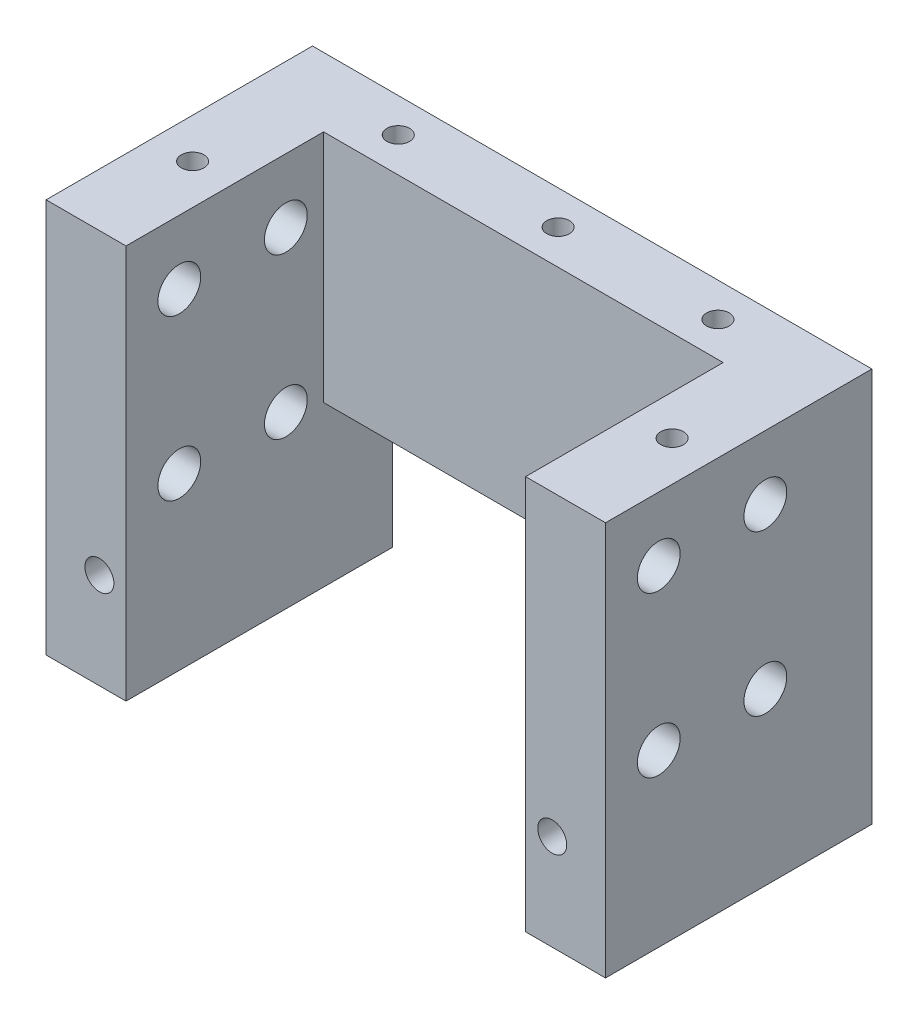
ISO-10303-21;
HEADER;
FILE_DESCRIPTION(('STEP AP214'),'2;1');
FILE_NAME('part.step','',(''),(''),'','','');
FILE_SCHEMA(('AUTOMOTIVE_DESIGN { 1 0 10303 214 1 1 1 1 }'));
ENDSEC;
DATA;
#1=APPLICATION_CONTEXT('core data for automotive mechanical design processes');
#2=APPLICATION_PROTOCOL_DEFINITION('international standard','automotive_design',2000,#1);
#3=PRODUCT_CONTEXT('',#1,'mechanical');
#4=PRODUCT('Part','Part','',(#3));
#5=PRODUCT_RELATED_PRODUCT_CATEGORY('part','',(#4));
#6=PRODUCT_DEFINITION_FORMATION('','',#4);
#7=PRODUCT_DEFINITION_CONTEXT('part definition',#1,'design');
#8=PRODUCT_DEFINITION('design','',#6,#7);
#9=PRODUCT_DEFINITION_SHAPE('','',#8);
#10=(LENGTH_UNIT() NAMED_UNIT(*) SI_UNIT(.MILLI.,.METRE.));
#11=(NAMED_UNIT(*) PLANE_ANGLE_UNIT() SI_UNIT($,.RADIAN.));
#12=(NAMED_UNIT(*) SI_UNIT($,.STERADIAN.) SOLID_ANGLE_UNIT());
#13=UNCERTAINTY_MEASURE_WITH_UNIT(LENGTH_MEASURE(1.E-05),#10,'distance_accuracy_value','');
#14=(GEOMETRIC_REPRESENTATION_CONTEXT(3) GLOBAL_UNCERTAINTY_ASSIGNED_CONTEXT((#13)) GLOBAL_UNIT_ASSIGNED_CONTEXT((#10,
#11,#12)) REPRESENTATION_CONTEXT('',''));
#15=CARTESIAN_POINT('',(0.,0.,0.));
#16=DIRECTION('',(0.,0.,1.));
#17=DIRECTION('',(1.,0.,0.));
#18=AXIS2_PLACEMENT_3D('',#15,#16,#17);
#19=CARTESIAN_POINT('',(33.3375,23.495,-15.875));
#20=DIRECTION('',(-1.,0.,0.));
#21=DIRECTION('',(0.,0.,1.));
#22=AXIS2_PLACEMENT_3D('',#19,#20,#21);
#23=PLANE('',#22);
#24=CARTESIAN_POINT('',(33.3375,15.875,9.525));
#25=DIRECTION('',(1.,0.,0.));
#26=DIRECTION('',(0.,0.,-1.));
#27=AXIS2_PLACEMENT_3D('',#24,#25,#26);
#28=CIRCLE('',#27,2.55269999999999);
#29=CARTESIAN_POINT('',(33.3375,15.875,6.97230000000001));
#30=VERTEX_POINT('',#29);
#31=EDGE_CURVE('E219',#30,#30,#28,.T.);
#32=ORIENTED_EDGE('',*,*,#31,.F.);
#33=EDGE_LOOP('',(#32));
#34=FACE_BOUND('',#33,.T.);
#35=DIRECTION('',(0.,0.,-1.));
#36=VECTOR('',#35,1.);
#37=CARTESIAN_POINT('',(33.3375,-23.495,-15.875));
#38=LINE('',#37,#36);
#39=CARTESIAN_POINT('',(33.3375,-23.495,15.875));
#40=VERTEX_POINT('',#39);
#41=CARTESIAN_POINT('',(33.3375,-23.495,-15.875));
#42=VERTEX_POINT('',#41);
#43=EDGE_CURVE('E71',#40,#42,#38,.T.);
#44=ORIENTED_EDGE('',*,*,#43,.T.);
#45=DIRECTION('',(0.,-1.,0.));
#46=VECTOR('',#45,1.);
#47=CARTESIAN_POINT('',(33.3375,23.495,-15.875));
#48=LINE('',#47,#46);
#49=CARTESIAN_POINT('',(33.3375,23.495,-15.875));
#50=VERTEX_POINT('',#49);
#51=EDGE_CURVE('E299',#50,#42,#48,.T.);
#52=ORIENTED_EDGE('',*,*,#51,.F.);
#53=DIRECTION('',(0.,0.,-1.));
#54=VECTOR('',#53,1.);
#55=CARTESIAN_POINT('',(33.3375,23.495,-15.875));
#56=LINE('',#55,#54);
#57=CARTESIAN_POINT('',(33.3375,23.495,15.875));
#58=VERTEX_POINT('',#57);
#59=EDGE_CURVE('E285',#58,#50,#56,.T.);
#60=ORIENTED_EDGE('',*,*,#59,.F.);
#61=DIRECTION('',(0.,-1.,0.));
#62=VECTOR('',#61,1.);
#63=CARTESIAN_POINT('',(33.3375,23.495,15.875));
#64=LINE('',#63,#62);
#65=EDGE_CURVE('E45',#58,#40,#64,.T.);
#66=ORIENTED_EDGE('',*,*,#65,.T.);
#67=EDGE_LOOP('',(#44,#52,#60,#66));
#68=FACE_BOUND('',#67,.T.);
#69=CARTESIAN_POINT('',(33.3375,-3.175,9.525));
#70=DIRECTION('',(1.,0.,0.));
#71=DIRECTION('',(0.,0.,-1.));
#72=AXIS2_PLACEMENT_3D('',#69,#70,#71);
#73=CIRCLE('',#72,2.55269999999999);
#74=CARTESIAN_POINT('',(33.3375,-3.175,6.97230000000001));
#75=VERTEX_POINT('',#74);
#76=EDGE_CURVE('E237',#75,#75,#73,.T.);
#77=ORIENTED_EDGE('',*,*,#76,.F.);
#78=EDGE_LOOP('',(#77));
#79=FACE_BOUND('',#78,.T.);
#80=CARTESIAN_POINT('',(33.3375,-3.175,-3.175));
#81=DIRECTION('',(1.,0.,0.));
#82=DIRECTION('',(0.,0.,-1.));
#83=AXIS2_PLACEMENT_3D('',#80,#81,#82);
#84=CIRCLE('',#83,2.55269999999999);
#85=CARTESIAN_POINT('',(33.3375,-3.175,-5.72769999999999));
#86=VERTEX_POINT('',#85);
#87=EDGE_CURVE('E231',#86,#86,#84,.T.);
#88=ORIENTED_EDGE('',*,*,#87,.F.);
#89=EDGE_LOOP('',(#88));
#90=FACE_BOUND('',#89,.T.);
#91=CARTESIAN_POINT('',(33.3375,15.875,-3.175));
#92=DIRECTION('',(1.,0.,0.));
#93=DIRECTION('',(0.,0.,-1.));
#94=AXIS2_PLACEMENT_3D('',#91,#92,#93);
#95=CIRCLE('',#94,2.55269999999999);
#96=CARTESIAN_POINT('',(33.3375,15.875,-5.72769999999999));
#97=VERTEX_POINT('',#96);
#98=EDGE_CURVE('E225',#97,#97,#95,.T.);
#99=ORIENTED_EDGE('',*,*,#98,.F.);
#100=EDGE_LOOP('',(#99));
#101=FACE_BOUND('',#100,.T.);
#102=ADVANCED_FACE('F36',(#34,#68,#79,#90,#101),#23,.F.);
#103=CARTESIAN_POINT('',(0.,-23.495,0.));
#104=DIRECTION('',(0.,1.,0.));
#105=DIRECTION('',(0.,0.,1.));
#106=AXIS2_PLACEMENT_3D('',#103,#104,#105);
#107=PLANE('',#106);
#108=DIRECTION('',(0.,0.,1.));
#109=VECTOR('',#108,1.);
#110=CARTESIAN_POINT('',(23.8125,-23.495,15.875));
#111=LINE('',#110,#109);
#112=CARTESIAN_POINT('',(23.8125,-23.495,-15.875));
#113=VERTEX_POINT('',#112);
#114=CARTESIAN_POINT('',(23.8125,-23.495,15.875));
#115=VERTEX_POINT('',#114);
#116=EDGE_CURVE('E258',#113,#115,#111,.T.);
#117=ORIENTED_EDGE('',*,*,#116,.F.);
#118=DIRECTION('',(-1.,0.,0.));
#119=VECTOR('',#118,1.);
#120=CARTESIAN_POINT('',(-33.3375,-23.495,-15.875));
#121=LINE('',#120,#119);
#122=EDGE_CURVE('E283',#42,#113,#121,.T.);
#123=ORIENTED_EDGE('',*,*,#122,.F.);
#124=ORIENTED_EDGE('',*,*,#43,.F.);
#125=DIRECTION('',(1.,0.,0.));
#126=VECTOR('',#125,1.);
#127=CARTESIAN_POINT('',(-33.3375,-23.495,15.875));
#128=LINE('',#127,#126);
#129=EDGE_CURVE('E291',#115,#40,#128,.T.);
#130=ORIENTED_EDGE('',*,*,#129,.F.);
#131=EDGE_LOOP('',(#117,#123,#124,#130));
#132=FACE_BOUND('',#131,.T.);
#133=ADVANCED_FACE('F308',(#132),#107,.F.);
#134=CARTESIAN_POINT('',(-33.3375,23.495,15.875));
#135=DIRECTION('',(0.,0.,-1.));
#136=DIRECTION('',(-1.,0.,0.));
#137=AXIS2_PLACEMENT_3D('',#134,#135,#136);
#138=PLANE('',#137);
#139=CARTESIAN_POINT('',(-26.9875,-12.065,15.875));
#140=DIRECTION('',(0.,0.,1.));
#141=DIRECTION('',(1.,0.,0.));
#142=AXIS2_PLACEMENT_3D('',#139,#140,#141);
#143=CIRCLE('',#142,1.7272);
#144=CARTESIAN_POINT('',(-25.2603,-12.065,15.875));
#145=VERTEX_POINT('',#144);
#146=EDGE_CURVE('E183',#145,#145,#143,.T.);
#147=ORIENTED_EDGE('',*,*,#146,.F.);
#148=EDGE_LOOP('',(#147));
#149=FACE_BOUND('',#148,.T.);
#150=CARTESIAN_POINT('',(-33.3375,-23.495,15.875));
#151=VERTEX_POINT('',#150);
#152=CARTESIAN_POINT('',(-23.8125,-23.495,15.875));
#153=VERTEX_POINT('',#152);
#154=EDGE_CURVE('E292',#151,#153,#128,.T.);
#155=ORIENTED_EDGE('',*,*,#154,.T.);
#156=DIRECTION('',(0.,1.,0.));
#157=VECTOR('',#156,1.);
#158=CARTESIAN_POINT('',(-23.8125,-23.496,15.875));
#159=LINE('',#158,#157);
#160=CARTESIAN_POINT('',(-23.8125,23.495,15.875));
#161=VERTEX_POINT('',#160);
#162=EDGE_CURVE('E271',#153,#161,#159,.T.);
#163=ORIENTED_EDGE('',*,*,#162,.T.);
#164=DIRECTION('',(1.,0.,0.));
#165=VECTOR('',#164,1.);
#166=CARTESIAN_POINT('',(-33.3375,23.495,15.875));
#167=LINE('',#166,#165);
#168=CARTESIAN_POINT('',(-33.3375,23.495,15.875));
#169=VERTEX_POINT('',#168);
#170=EDGE_CURVE('E85',#169,#161,#167,.T.);
#171=ORIENTED_EDGE('',*,*,#170,.F.);
#172=DIRECTION('',(0.,-1.,0.));
#173=VECTOR('',#172,1.);
#174=CARTESIAN_POINT('',(-33.3375,23.495,15.875));
#175=LINE('',#174,#173);
#176=EDGE_CURVE('E11',#169,#151,#175,.T.);
#177=ORIENTED_EDGE('',*,*,#176,.T.);
#178=EDGE_LOOP('',(#155,#163,#171,#177));
#179=FACE_BOUND('',#178,.T.);
#180=ADVANCED_FACE('F324',(#149,#179),#138,.F.);
#181=CARTESIAN_POINT('',(-33.3375,23.495,-15.875));
#182=DIRECTION('',(1.,0.,0.));
#183=DIRECTION('',(0.,0.,-1.));
#184=AXIS2_PLACEMENT_3D('',#181,#182,#183);
#185=PLANE('',#184);
#186=CARTESIAN_POINT('',(-33.3375,15.875,9.525));
#187=DIRECTION('',(-1.,0.,0.));
#188=DIRECTION('',(0.,0.,1.));
#189=AXIS2_PLACEMENT_3D('',#186,#187,#188);
#190=CIRCLE('',#189,2.55269999999999);
#191=CARTESIAN_POINT('',(-33.3375,15.875,12.0777));
#192=VERTEX_POINT('',#191);
#193=EDGE_CURVE('E195',#192,#192,#190,.T.);
#194=ORIENTED_EDGE('',*,*,#193,.F.);
#195=EDGE_LOOP('',(#194));
#196=FACE_BOUND('',#195,.T.);
#197=CARTESIAN_POINT('',(-33.3375,15.875,-3.175));
#198=DIRECTION('',(-1.,0.,0.));
#199=DIRECTION('',(0.,0.,1.));
#200=AXIS2_PLACEMENT_3D('',#197,#198,#199);
#201=CIRCLE('',#200,2.55269999999999);
#202=CARTESIAN_POINT('',(-33.3375,15.875,-0.622300000000011));
#203=VERTEX_POINT('',#202);
#204=EDGE_CURVE('E201',#203,#203,#201,.T.);
#205=ORIENTED_EDGE('',*,*,#204,.F.);
#206=EDGE_LOOP('',(#205));
#207=FACE_BOUND('',#206,.T.);
#208=CARTESIAN_POINT('',(-33.3375,-3.175,-3.175));
#209=DIRECTION('',(-1.,0.,0.));
#210=DIRECTION('',(0.,0.,1.));
#211=AXIS2_PLACEMENT_3D('',#208,#209,#210);
#212=CIRCLE('',#211,2.55269999999999);
#213=CARTESIAN_POINT('',(-33.3375,-3.175,-0.622300000000011));
#214=VERTEX_POINT('',#213);
#215=EDGE_CURVE('E207',#214,#214,#212,.T.);
#216=ORIENTED_EDGE('',*,*,#215,.F.);
#217=EDGE_LOOP('',(#216));
#218=FACE_BOUND('',#217,.T.);
#219=CARTESIAN_POINT('',(-33.3375,-3.175,9.525));
#220=DIRECTION('',(-1.,0.,0.));
#221=DIRECTION('',(0.,0.,1.));
#222=AXIS2_PLACEMENT_3D('',#219,#220,#221);
#223=CIRCLE('',#222,2.55269999999999);
#224=CARTESIAN_POINT('',(-33.3375,-3.175,12.0777));
#225=VERTEX_POINT('',#224);
#226=EDGE_CURVE('E213',#225,#225,#223,.T.);
#227=ORIENTED_EDGE('',*,*,#226,.F.);
#228=EDGE_LOOP('',(#227));
#229=FACE_BOUND('',#228,.T.);
#230=DIRECTION('',(0.,0.,1.));
#231=VECTOR('',#230,1.);
#232=CARTESIAN_POINT('',(-33.3375,-23.495,-15.875));
#233=LINE('',#232,#231);
#234=CARTESIAN_POINT('',(-33.3375,-23.495,-15.875));
#235=VERTEX_POINT('',#234);
#236=EDGE_CURVE('E274',#235,#151,#233,.T.);
#237=ORIENTED_EDGE('',*,*,#236,.T.);
#238=ORIENTED_EDGE('',*,*,#176,.F.);
#239=DIRECTION('',(0.,0.,1.));
#240=VECTOR('',#239,1.);
#241=CARTESIAN_POINT('',(-33.3375,23.495,-15.875));
#242=LINE('',#241,#240);
#243=CARTESIAN_POINT('',(-33.3375,23.495,-15.875));
#244=VERTEX_POINT('',#243);
#245=EDGE_CURVE('E280',#244,#169,#242,.T.);
#246=ORIENTED_EDGE('',*,*,#245,.F.);
#247=DIRECTION('',(0.,-1.,0.));
#248=VECTOR('',#247,1.);
#249=CARTESIAN_POINT('',(-33.3375,23.495,-15.875));
#250=LINE('',#249,#248);
#251=EDGE_CURVE('E288',#244,#235,#250,.T.);
#252=ORIENTED_EDGE('',*,*,#251,.T.);
#253=EDGE_LOOP('',(#237,#238,#246,#252));
#254=FACE_BOUND('',#253,.T.);
#255=ADVANCED_FACE('F38',(#196,#207,#218,#229,#254),#185,.F.);
#256=CARTESIAN_POINT('',(26.9875,-12.065,15.875));
#257=DIRECTION('',(0.,0.,1.));
#258=DIRECTION('',(1.,0.,0.));
#259=AXIS2_PLACEMENT_3D('',#256,#257,#258);
#260=CIRCLE('',#259,1.7272);
#261=CARTESIAN_POINT('',(28.7147,-12.065,15.875));
#262=VERTEX_POINT('',#261);
#263=EDGE_CURVE('E189',#262,#262,#260,.T.);
#264=ORIENTED_EDGE('',*,*,#263,.F.);
#265=EDGE_LOOP('',(#264));
#266=FACE_BOUND('',#265,.T.);
#267=CARTESIAN_POINT('',(23.8125,23.495,15.875));
#268=VERTEX_POINT('',#267);
#269=EDGE_CURVE('E282',#268,#58,#167,.T.);
#270=ORIENTED_EDGE('',*,*,#269,.F.);
#271=DIRECTION('',(0.,1.,0.));
#272=VECTOR('',#271,1.);
#273=CARTESIAN_POINT('',(23.8125,-23.496,15.875));
#274=LINE('',#273,#272);
#275=EDGE_CURVE('E277',#115,#268,#274,.T.);
#276=ORIENTED_EDGE('',*,*,#275,.F.);
#277=ORIENTED_EDGE('',*,*,#129,.T.);
#278=ORIENTED_EDGE('',*,*,#65,.F.);
#279=EDGE_LOOP('',(#270,#276,#277,#278));
#280=FACE_BOUND('',#279,.T.);
#281=ADVANCED_FACE('F336',(#266,#280),#138,.F.);
#282=CARTESIAN_POINT('',(-33.3375,23.495,-15.875));
#283=DIRECTION('',(0.,0.,1.));
#284=DIRECTION('',(1.,0.,0.));
#285=AXIS2_PLACEMENT_3D('',#282,#283,#284);
#286=PLANE('',#285);
#287=ORIENTED_EDGE('',*,*,#122,.T.);
#288=DIRECTION('',(0.,-1.,0.));
#289=VECTOR('',#288,1.);
#290=CARTESIAN_POINT('',(23.8125,-23.495,-15.875));
#291=LINE('',#290,#289);
#292=CARTESIAN_POINT('',(23.8125,-4.445,-15.875));
#293=VERTEX_POINT('',#292);
#294=EDGE_CURVE('E246',#293,#113,#291,.T.);
#295=ORIENTED_EDGE('',*,*,#294,.F.);
#296=DIRECTION('',(1.,0.,0.));
#297=VECTOR('',#296,1.);
#298=CARTESIAN_POINT('',(23.8125,-4.445,-15.875));
#299=LINE('',#298,#297);
#300=CARTESIAN_POINT('',(-23.8125,-4.445,-15.875));
#301=VERTEX_POINT('',#300);
#302=EDGE_CURVE('E252',#301,#293,#299,.T.);
#303=ORIENTED_EDGE('',*,*,#302,.F.);
#304=DIRECTION('',(0.,1.,0.));
#305=VECTOR('',#304,1.);
#306=CARTESIAN_POINT('',(-23.8125,-23.495,-15.875));
#307=LINE('',#306,#305);
#308=CARTESIAN_POINT('',(-23.8125,-23.495,-15.875));
#309=VERTEX_POINT('',#308);
#310=EDGE_CURVE('E249',#309,#301,#307,.T.);
#311=ORIENTED_EDGE('',*,*,#310,.F.);
#312=EDGE_CURVE('E78',#309,#235,#121,.T.);
#313=ORIENTED_EDGE('',*,*,#312,.T.);
#314=ORIENTED_EDGE('',*,*,#251,.F.);
#315=DIRECTION('',(-1.,0.,0.));
#316=VECTOR('',#315,1.);
#317=CARTESIAN_POINT('',(-33.3375,23.495,-15.875));
#318=LINE('',#317,#316);
#319=EDGE_CURVE('E53',#50,#244,#318,.T.);
#320=ORIENTED_EDGE('',*,*,#319,.F.);
#321=ORIENTED_EDGE('',*,*,#51,.T.);
#322=EDGE_LOOP('',(#287,#295,#303,#311,#313,#314,#320,#321));
#323=FACE_BOUND('',#322,.T.);
#324=ADVANCED_FACE('F310',(#323),#286,.F.);
#325=CARTESIAN_POINT('',(0.,23.495,0.));
#326=DIRECTION('',(0.,1.,0.));
#327=DIRECTION('',(0.,0.,1.));
#328=AXIS2_PLACEMENT_3D('',#325,#326,#327);
#329=PLANE('',#328);
#330=CARTESIAN_POINT('',(0.,23.495,-11.811));
#331=DIRECTION('',(0.,1.,0.));
#332=DIRECTION('',(0.,0.,1.));
#333=AXIS2_PLACEMENT_3D('',#330,#331,#332);
#334=CIRCLE('',#333,1.35255);
#335=CARTESIAN_POINT('',(0.,23.495,-10.45845));
#336=VERTEX_POINT('',#335);
#337=EDGE_CURVE('E155',#336,#336,#334,.T.);
#338=ORIENTED_EDGE('',*,*,#337,.F.);
#339=EDGE_LOOP('',(#338));
#340=FACE_BOUND('',#339,.T.);
#341=CARTESIAN_POINT('',(19.05,23.495,-11.811));
#342=DIRECTION('',(0.,1.,0.));
#343=DIRECTION('',(0.,0.,1.));
#344=AXIS2_PLACEMENT_3D('',#341,#342,#343);
#345=CIRCLE('',#344,1.35255);
#346=CARTESIAN_POINT('',(19.05,23.495,-10.45845));
#347=VERTEX_POINT('',#346);
#348=EDGE_CURVE('E154',#347,#347,#345,.T.);
#349=ORIENTED_EDGE('',*,*,#348,.F.);
#350=EDGE_LOOP('',(#349));
#351=FACE_BOUND('',#350,.T.);
#352=CARTESIAN_POINT('',(-19.05,23.495,-11.811));
#353=DIRECTION('',(0.,1.,0.));
#354=DIRECTION('',(0.,0.,1.));
#355=AXIS2_PLACEMENT_3D('',#352,#353,#354);
#356=CIRCLE('',#355,1.35255);
#357=CARTESIAN_POINT('',(-19.05,23.495,-10.45845));
#358=VERTEX_POINT('',#357);
#359=EDGE_CURVE('E165',#358,#358,#356,.T.);
#360=ORIENTED_EDGE('',*,*,#359,.F.);
#361=EDGE_LOOP('',(#360));
#362=FACE_BOUND('',#361,.T.);
#363=CARTESIAN_POINT('',(-28.575,23.495,3.175));
#364=DIRECTION('',(0.,1.,0.));
#365=DIRECTION('',(0.,0.,1.));
#366=AXIS2_PLACEMENT_3D('',#363,#364,#365);
#367=CIRCLE('',#366,1.35255);
#368=CARTESIAN_POINT('',(-28.575,23.495,4.52755));
#369=VERTEX_POINT('',#368);
#370=EDGE_CURVE('E171',#369,#369,#367,.T.);
#371=ORIENTED_EDGE('',*,*,#370,.F.);
#372=EDGE_LOOP('',(#371));
#373=FACE_BOUND('',#372,.T.);
#374=CARTESIAN_POINT('',(28.575,23.495,3.175));
#375=DIRECTION('',(0.,1.,0.));
#376=DIRECTION('',(0.,0.,1.));
#377=AXIS2_PLACEMENT_3D('',#374,#375,#376);
#378=CIRCLE('',#377,1.35255);
#379=CARTESIAN_POINT('',(28.575,23.495,4.52755));
#380=VERTEX_POINT('',#379);
#381=EDGE_CURVE('E177',#380,#380,#378,.T.);
#382=ORIENTED_EDGE('',*,*,#381,.F.);
#383=EDGE_LOOP('',(#382));
#384=FACE_BOUND('',#383,.T.);
#385=DIRECTION('',(0.,0.,1.));
#386=VECTOR('',#385,1.);
#387=CARTESIAN_POINT('',(-23.8125,23.495,15.875));
#388=LINE('',#387,#386);
#389=CARTESIAN_POINT('',(-23.8125,23.495,-7.67532857767246));
#390=VERTEX_POINT('',#389);
#391=EDGE_CURVE('E263',#390,#161,#388,.T.);
#392=ORIENTED_EDGE('',*,*,#391,.F.);
#393=DIRECTION('',(-1.,0.,0.));
#394=VECTOR('',#393,1.);
#395=CARTESIAN_POINT('',(-23.8125,23.495,-7.67532857767246));
#396=LINE('',#395,#394);
#397=CARTESIAN_POINT('',(23.8125,23.495,-7.67532857767246));
#398=VERTEX_POINT('',#397);
#399=EDGE_CURVE('E268',#398,#390,#396,.T.);
#400=ORIENTED_EDGE('',*,*,#399,.F.);
#401=DIRECTION('',(0.,0.,-1.));
#402=VECTOR('',#401,1.);
#403=CARTESIAN_POINT('',(23.8125,23.495,15.875));
#404=LINE('',#403,#402);
#405=EDGE_CURVE('E265',#268,#398,#404,.T.);
#406=ORIENTED_EDGE('',*,*,#405,.F.);
#407=ORIENTED_EDGE('',*,*,#269,.T.);
#408=ORIENTED_EDGE('',*,*,#59,.T.);
#409=ORIENTED_EDGE('',*,*,#319,.T.);
#410=ORIENTED_EDGE('',*,*,#245,.T.);
#411=ORIENTED_EDGE('',*,*,#170,.T.);
#412=EDGE_LOOP('',(#392,#400,#406,#407,#408,#409,#410,#411));
#413=FACE_BOUND('',#412,.T.);
#414=ADVANCED_FACE('F317',(#340,#351,#362,#373,#384,#413),#329,.T.);
#415=ORIENTED_EDGE('',*,*,#312,.F.);
#416=DIRECTION('',(0.,0.,-1.));
#417=VECTOR('',#416,1.);
#418=CARTESIAN_POINT('',(-23.8125,-23.495,15.875));
#419=LINE('',#418,#417);
#420=EDGE_CURVE('E261',#153,#309,#419,.T.);
#421=ORIENTED_EDGE('',*,*,#420,.F.);
#422=ORIENTED_EDGE('',*,*,#154,.F.);
#423=ORIENTED_EDGE('',*,*,#236,.F.);
#424=EDGE_LOOP('',(#415,#421,#422,#423));
#425=FACE_BOUND('',#424,.T.);
#426=ADVANCED_FACE('F326',(#425),#107,.F.);
#427=CARTESIAN_POINT('',(-23.8125,-23.496,15.875));
#428=DIRECTION('',(-1.,0.,0.));
#429=DIRECTION('',(0.,0.,1.));
#430=AXIS2_PLACEMENT_3D('',#427,#428,#429);
#431=PLANE('',#430);
#432=CARTESIAN_POINT('',(-23.8125,15.875,9.525));
#433=DIRECTION('',(-1.,0.,0.));
#434=DIRECTION('',(0.,0.,1.));
#435=AXIS2_PLACEMENT_3D('',#432,#433,#434);
#436=CIRCLE('',#435,2.55269999999999);
#437=CARTESIAN_POINT('',(-23.8125,15.875,12.0777));
#438=VERTEX_POINT('',#437);
#439=EDGE_CURVE('E198',#438,#438,#436,.T.);
#440=ORIENTED_EDGE('',*,*,#439,.T.);
#441=EDGE_LOOP('',(#440));
#442=FACE_BOUND('',#441,.T.);
#443=CARTESIAN_POINT('',(-23.8125,15.875,-3.175));
#444=DIRECTION('',(-1.,0.,0.));
#445=DIRECTION('',(0.,0.,1.));
#446=AXIS2_PLACEMENT_3D('',#443,#444,#445);
#447=CIRCLE('',#446,2.55269999999999);
#448=CARTESIAN_POINT('',(-23.8125,15.875,-0.622300000000006));
#449=VERTEX_POINT('',#448);
#450=EDGE_CURVE('E204',#449,#449,#447,.T.);
#451=ORIENTED_EDGE('',*,*,#450,.T.);
#452=EDGE_LOOP('',(#451));
#453=FACE_BOUND('',#452,.T.);
#454=CARTESIAN_POINT('',(-23.8125,-3.175,-3.175));
#455=DIRECTION('',(-1.,0.,0.));
#456=DIRECTION('',(0.,0.,1.));
#457=AXIS2_PLACEMENT_3D('',#454,#455,#456);
#458=CIRCLE('',#457,2.55269999999999);
#459=CARTESIAN_POINT('',(-23.8125,-3.175,-0.622300000000006));
#460=VERTEX_POINT('',#459);
#461=EDGE_CURVE('E210',#460,#460,#458,.T.);
#462=ORIENTED_EDGE('',*,*,#461,.T.);
#463=EDGE_LOOP('',(#462));
#464=FACE_BOUND('',#463,.T.);
#465=CARTESIAN_POINT('',(-23.8125,-3.175,9.525));
#466=DIRECTION('',(-1.,0.,0.));
#467=DIRECTION('',(0.,0.,1.));
#468=AXIS2_PLACEMENT_3D('',#465,#466,#467);
#469=CIRCLE('',#468,2.55269999999999);
#470=CARTESIAN_POINT('',(-23.8125,-3.175,12.0777));
#471=VERTEX_POINT('',#470);
#472=EDGE_CURVE('E216',#471,#471,#469,.T.);
#473=ORIENTED_EDGE('',*,*,#472,.T.);
#474=EDGE_LOOP('',(#473));
#475=FACE_BOUND('',#474,.T.);
#476=ORIENTED_EDGE('',*,*,#420,.T.);
#477=ORIENTED_EDGE('',*,*,#310,.T.);
#478=DIRECTION('',(0.,0.,-1.));
#479=VECTOR('',#478,1.);
#480=CARTESIAN_POINT('',(-23.8125,-4.445,15.876));
#481=LINE('',#480,#479);
#482=CARTESIAN_POINT('',(-23.8125,-4.445,-7.67532857767246));
#483=VERTEX_POINT('',#482);
#484=EDGE_CURVE('E255',#483,#301,#481,.T.);
#485=ORIENTED_EDGE('',*,*,#484,.F.);
#486=DIRECTION('',(0.,1.,0.));
#487=VECTOR('',#486,1.);
#488=CARTESIAN_POINT('',(-23.8125,-23.496,-7.67532857767246));
#489=LINE('',#488,#487);
#490=EDGE_CURVE('E272',#483,#390,#489,.T.);
#491=ORIENTED_EDGE('',*,*,#490,.T.);
#492=ORIENTED_EDGE('',*,*,#391,.T.);
#493=ORIENTED_EDGE('',*,*,#162,.F.);
#494=EDGE_LOOP('',(#476,#477,#485,#491,#492,#493));
#495=FACE_BOUND('',#494,.T.);
#496=ADVANCED_FACE('F321',(#442,#453,#464,#475,#495),#431,.F.);
#497=CARTESIAN_POINT('',(-23.8125,-23.496,-7.67532857767246));
#498=DIRECTION('',(0.,0.,-1.));
#499=DIRECTION('',(-1.,0.,0.));
#500=AXIS2_PLACEMENT_3D('',#497,#498,#499);
#501=PLANE('',#500);
#502=ORIENTED_EDGE('',*,*,#490,.F.);
#503=DIRECTION('',(-1.,0.,0.));
#504=VECTOR('',#503,1.);
#505=CARTESIAN_POINT('',(23.8125,-4.445,-7.67532857767246));
#506=LINE('',#505,#504);
#507=CARTESIAN_POINT('',(23.8125,-4.445,-7.67532857767246));
#508=VERTEX_POINT('',#507);
#509=EDGE_CURVE('E243',#508,#483,#506,.T.);
#510=ORIENTED_EDGE('',*,*,#509,.F.);
#511=DIRECTION('',(0.,1.,0.));
#512=VECTOR('',#511,1.);
#513=CARTESIAN_POINT('',(23.8125,-23.496,-7.67532857767246));
#514=LINE('',#513,#512);
#515=EDGE_CURVE('E275',#508,#398,#514,.T.);
#516=ORIENTED_EDGE('',*,*,#515,.T.);
#517=ORIENTED_EDGE('',*,*,#399,.T.);
#518=EDGE_LOOP('',(#502,#510,#516,#517));
#519=FACE_BOUND('',#518,.T.);
#520=ADVANCED_FACE('F332',(#519),#501,.F.);
#521=CARTESIAN_POINT('',(23.8125,-23.496,15.875));
#522=DIRECTION('',(1.,0.,0.));
#523=DIRECTION('',(0.,0.,-1.));
#524=AXIS2_PLACEMENT_3D('',#521,#522,#523);
#525=PLANE('',#524);
#526=CARTESIAN_POINT('',(23.8125,15.875,9.525));
#527=DIRECTION('',(1.,0.,0.));
#528=DIRECTION('',(0.,0.,-1.));
#529=AXIS2_PLACEMENT_3D('',#526,#527,#528);
#530=CIRCLE('',#529,2.55269999999999);
#531=CARTESIAN_POINT('',(23.8125,15.875,6.97230000000001));
#532=VERTEX_POINT('',#531);
#533=EDGE_CURVE('E222',#532,#532,#530,.T.);
#534=ORIENTED_EDGE('',*,*,#533,.T.);
#535=EDGE_LOOP('',(#534));
#536=FACE_BOUND('',#535,.T.);
#537=CARTESIAN_POINT('',(23.8125,15.875,-3.175));
#538=DIRECTION('',(1.,0.,0.));
#539=DIRECTION('',(0.,0.,-1.));
#540=AXIS2_PLACEMENT_3D('',#537,#538,#539);
#541=CIRCLE('',#540,2.55269999999999);
#542=CARTESIAN_POINT('',(23.8125,15.875,-5.72769999999999));
#543=VERTEX_POINT('',#542);
#544=EDGE_CURVE('E228',#543,#543,#541,.T.);
#545=ORIENTED_EDGE('',*,*,#544,.T.);
#546=EDGE_LOOP('',(#545));
#547=FACE_BOUND('',#546,.T.);
#548=CARTESIAN_POINT('',(23.8125,-3.175,-3.175));
#549=DIRECTION('',(1.,0.,0.));
#550=DIRECTION('',(0.,0.,-1.));
#551=AXIS2_PLACEMENT_3D('',#548,#549,#550);
#552=CIRCLE('',#551,2.55269999999999);
#553=CARTESIAN_POINT('',(23.8125,-3.175,-5.72769999999999));
#554=VERTEX_POINT('',#553);
#555=EDGE_CURVE('E234',#554,#554,#552,.T.);
#556=ORIENTED_EDGE('',*,*,#555,.T.);
#557=EDGE_LOOP('',(#556));
#558=FACE_BOUND('',#557,.T.);
#559=CARTESIAN_POINT('',(23.8125,-3.175,9.525));
#560=DIRECTION('',(1.,0.,0.));
#561=DIRECTION('',(0.,0.,-1.));
#562=AXIS2_PLACEMENT_3D('',#559,#560,#561);
#563=CIRCLE('',#562,2.55269999999999);
#564=CARTESIAN_POINT('',(23.8125,-3.175,6.97230000000001));
#565=VERTEX_POINT('',#564);
#566=EDGE_CURVE('E240',#565,#565,#563,.T.);
#567=ORIENTED_EDGE('',*,*,#566,.T.);
#568=EDGE_LOOP('',(#567));
#569=FACE_BOUND('',#568,.T.);
#570=ORIENTED_EDGE('',*,*,#116,.T.);
#571=ORIENTED_EDGE('',*,*,#275,.T.);
#572=ORIENTED_EDGE('',*,*,#405,.T.);
#573=ORIENTED_EDGE('',*,*,#515,.F.);
#574=DIRECTION('',(0.,0.,-1.));
#575=VECTOR('',#574,1.);
#576=CARTESIAN_POINT('',(23.8125,-4.445,15.876));
#577=LINE('',#576,#575);
#578=EDGE_CURVE('E256',#508,#293,#577,.T.);
#579=ORIENTED_EDGE('',*,*,#578,.T.);
#580=ORIENTED_EDGE('',*,*,#294,.T.);
#581=EDGE_LOOP('',(#570,#571,#572,#573,#579,#580));
#582=FACE_BOUND('',#581,.T.);
#583=ADVANCED_FACE('F334',(#536,#547,#558,#569,#582),#525,.F.);
#584=CARTESIAN_POINT('',(23.8125,-4.445,15.876));
#585=DIRECTION('',(0.,1.,0.));
#586=DIRECTION('',(0.,0.,1.));
#587=AXIS2_PLACEMENT_3D('',#584,#585,#586);
#588=PLANE('',#587);
#589=ORIENTED_EDGE('',*,*,#509,.T.);
#590=ORIENTED_EDGE('',*,*,#484,.T.);
#591=ORIENTED_EDGE('',*,*,#302,.T.);
#592=ORIENTED_EDGE('',*,*,#578,.F.);
#593=EDGE_LOOP('',(#589,#590,#591,#592));
#594=FACE_BOUND('',#593,.T.);
#595=ADVANCED_FACE('F328',(#594),#588,.F.);
#596=CARTESIAN_POINT('',(33.3375,-3.175,9.525));
#597=DIRECTION('',(1.,0.,0.));
#598=DIRECTION('',(0.,0.,-1.));
#599=AXIS2_PLACEMENT_3D('',#596,#597,#598);
#600=CYLINDRICAL_SURFACE('',#599,2.55269999999999);
#601=ORIENTED_EDGE('',*,*,#566,.F.);
#602=EDGE_LOOP('',(#601));
#603=FACE_BOUND('',#602,.T.);
#604=ORIENTED_EDGE('',*,*,#76,.T.);
#605=EDGE_LOOP('',(#604));
#606=FACE_BOUND('',#605,.T.);
#607=ADVANCED_FACE('F371',(#603,#606),#600,.F.);
#608=CARTESIAN_POINT('',(33.3375,-3.175,-3.175));
#609=DIRECTION('',(1.,0.,0.));
#610=DIRECTION('',(0.,0.,-1.));
#611=AXIS2_PLACEMENT_3D('',#608,#609,#610);
#612=CYLINDRICAL_SURFACE('',#611,2.55269999999999);
#613=ORIENTED_EDGE('',*,*,#555,.F.);
#614=EDGE_LOOP('',(#613));
#615=FACE_BOUND('',#614,.T.);
#616=ORIENTED_EDGE('',*,*,#87,.T.);
#617=EDGE_LOOP('',(#616));
#618=FACE_BOUND('',#617,.T.);
#619=ADVANCED_FACE('F374',(#615,#618),#612,.F.);
#620=CARTESIAN_POINT('',(33.3375,15.875,-3.175));
#621=DIRECTION('',(1.,0.,0.));
#622=DIRECTION('',(0.,0.,-1.));
#623=AXIS2_PLACEMENT_3D('',#620,#621,#622);
#624=CYLINDRICAL_SURFACE('',#623,2.55269999999999);
#625=ORIENTED_EDGE('',*,*,#544,.F.);
#626=EDGE_LOOP('',(#625));
#627=FACE_BOUND('',#626,.T.);
#628=ORIENTED_EDGE('',*,*,#98,.T.);
#629=EDGE_LOOP('',(#628));
#630=FACE_BOUND('',#629,.T.);
#631=ADVANCED_FACE('F378',(#627,#630),#624,.F.);
#632=CARTESIAN_POINT('',(33.3375,15.875,9.525));
#633=DIRECTION('',(1.,0.,0.));
#634=DIRECTION('',(0.,0.,-1.));
#635=AXIS2_PLACEMENT_3D('',#632,#633,#634);
#636=CYLINDRICAL_SURFACE('',#635,2.55269999999999);
#637=ORIENTED_EDGE('',*,*,#533,.F.);
#638=EDGE_LOOP('',(#637));
#639=FACE_BOUND('',#638,.T.);
#640=ORIENTED_EDGE('',*,*,#31,.T.);
#641=EDGE_LOOP('',(#640));
#642=FACE_BOUND('',#641,.T.);
#643=ADVANCED_FACE('F382',(#639,#642),#636,.F.);
#644=CARTESIAN_POINT('',(-33.3375,-3.175,9.525));
#645=DIRECTION('',(-1.,0.,0.));
#646=DIRECTION('',(0.,0.,1.));
#647=AXIS2_PLACEMENT_3D('',#644,#645,#646);
#648=CYLINDRICAL_SURFACE('',#647,2.55269999999999);
#649=ORIENTED_EDGE('',*,*,#472,.F.);
#650=EDGE_LOOP('',(#649));
#651=FACE_BOUND('',#650,.T.);
#652=ORIENTED_EDGE('',*,*,#226,.T.);
#653=EDGE_LOOP('',(#652));
#654=FACE_BOUND('',#653,.T.);
#655=ADVANCED_FACE('F386',(#651,#654),#648,.F.);
#656=CARTESIAN_POINT('',(-33.3375,-3.175,-3.175));
#657=DIRECTION('',(-1.,0.,0.));
#658=DIRECTION('',(0.,0.,1.));
#659=AXIS2_PLACEMENT_3D('',#656,#657,#658);
#660=CYLINDRICAL_SURFACE('',#659,2.55269999999999);
#661=ORIENTED_EDGE('',*,*,#461,.F.);
#662=EDGE_LOOP('',(#661));
#663=FACE_BOUND('',#662,.T.);
#664=ORIENTED_EDGE('',*,*,#215,.T.);
#665=EDGE_LOOP('',(#664));
#666=FACE_BOUND('',#665,.T.);
#667=ADVANCED_FACE('F390',(#663,#666),#660,.F.);
#668=CARTESIAN_POINT('',(-33.3375,15.875,-3.175));
#669=DIRECTION('',(-1.,0.,0.));
#670=DIRECTION('',(0.,0.,1.));
#671=AXIS2_PLACEMENT_3D('',#668,#669,#670);
#672=CYLINDRICAL_SURFACE('',#671,2.55269999999999);
#673=ORIENTED_EDGE('',*,*,#450,.F.);
#674=EDGE_LOOP('',(#673));
#675=FACE_BOUND('',#674,.T.);
#676=ORIENTED_EDGE('',*,*,#204,.T.);
#677=EDGE_LOOP('',(#676));
#678=FACE_BOUND('',#677,.T.);
#679=ADVANCED_FACE('F394',(#675,#678),#672,.F.);
#680=CARTESIAN_POINT('',(-33.3375,15.875,9.525));
#681=DIRECTION('',(-1.,0.,0.));
#682=DIRECTION('',(0.,0.,1.));
#683=AXIS2_PLACEMENT_3D('',#680,#681,#682);
#684=CYLINDRICAL_SURFACE('',#683,2.55269999999999);
#685=ORIENTED_EDGE('',*,*,#439,.F.);
#686=EDGE_LOOP('',(#685));
#687=FACE_BOUND('',#686,.T.);
#688=ORIENTED_EDGE('',*,*,#193,.T.);
#689=EDGE_LOOP('',(#688));
#690=FACE_BOUND('',#689,.T.);
#691=ADVANCED_FACE('F398',(#687,#690),#684,.F.);
#692=CARTESIAN_POINT('',(26.9875,-12.065,3.429));
#693=DIRECTION('',(0.,0.,1.));
#694=DIRECTION('',(1.,0.,0.));
#695=AXIS2_PLACEMENT_3D('',#692,#693,#694);
#696=CONICAL_SURFACE('',#695,1.72719999999999,1.02974425867665);
#697=CARTESIAN_POINT('',(26.9875,-12.065,2.3911935388156));
#698=VERTEX_POINT('',#697);
#699=VERTEX_LOOP('',#698);
#700=FACE_BOUND('',#699,.T.);
#701=CARTESIAN_POINT('',(26.9875,-12.065,3.429));
#702=DIRECTION('',(0.,0.,1.));
#703=DIRECTION('',(1.,0.,0.));
#704=AXIS2_PLACEMENT_3D('',#701,#702,#703);
#705=CIRCLE('',#704,1.72719999999999);
#706=CARTESIAN_POINT('',(28.7147,-12.065,3.429));
#707=VERTEX_POINT('',#706);
#708=EDGE_CURVE('E192',#707,#707,#705,.T.);
#709=ORIENTED_EDGE('',*,*,#708,.T.);
#710=EDGE_LOOP('',(#709));
#711=FACE_BOUND('',#710,.T.);
#712=ADVANCED_FACE('F402',(#700,#711),#696,.F.);
#713=CARTESIAN_POINT('',(26.9875,-12.065,15.875));
#714=DIRECTION('',(0.,0.,1.));
#715=DIRECTION('',(1.,0.,0.));
#716=AXIS2_PLACEMENT_3D('',#713,#714,#715);
#717=CYLINDRICAL_SURFACE('',#716,1.7272);
#718=ORIENTED_EDGE('',*,*,#708,.F.);
#719=EDGE_LOOP('',(#718));
#720=FACE_BOUND('',#719,.T.);
#721=ORIENTED_EDGE('',*,*,#263,.T.);
#722=EDGE_LOOP('',(#721));
#723=FACE_BOUND('',#722,.T.);
#724=ADVANCED_FACE('F406',(#720,#723),#717,.F.);
#725=CARTESIAN_POINT('',(-26.9875,-12.065,3.429));
#726=DIRECTION('',(0.,0.,1.));
#727=DIRECTION('',(1.,0.,0.));
#728=AXIS2_PLACEMENT_3D('',#725,#726,#727);
#729=CONICAL_SURFACE('',#728,1.72719999999999,1.02974425867665);
#730=CARTESIAN_POINT('',(-26.9875,-12.065,2.3911935388156));
#731=VERTEX_POINT('',#730);
#732=VERTEX_LOOP('',#731);
#733=FACE_BOUND('',#732,.T.);
#734=CARTESIAN_POINT('',(-26.9875,-12.065,3.429));
#735=DIRECTION('',(0.,0.,1.));
#736=DIRECTION('',(1.,0.,0.));
#737=AXIS2_PLACEMENT_3D('',#734,#735,#736);
#738=CIRCLE('',#737,1.72719999999999);
#739=CARTESIAN_POINT('',(-25.2603,-12.065,3.429));
#740=VERTEX_POINT('',#739);
#741=EDGE_CURVE('E186',#740,#740,#738,.T.);
#742=ORIENTED_EDGE('',*,*,#741,.T.);
#743=EDGE_LOOP('',(#742));
#744=FACE_BOUND('',#743,.T.);
#745=ADVANCED_FACE('F410',(#733,#744),#729,.F.);
#746=CARTESIAN_POINT('',(-26.9875,-12.065,15.875));
#747=DIRECTION('',(0.,0.,1.));
#748=DIRECTION('',(1.,0.,0.));
#749=AXIS2_PLACEMENT_3D('',#746,#747,#748);
#750=CYLINDRICAL_SURFACE('',#749,1.7272);
#751=ORIENTED_EDGE('',*,*,#741,.F.);
#752=EDGE_LOOP('',(#751));
#753=FACE_BOUND('',#752,.T.);
#754=ORIENTED_EDGE('',*,*,#146,.T.);
#755=EDGE_LOOP('',(#754));
#756=FACE_BOUND('',#755,.T.);
#757=ADVANCED_FACE('F414',(#753,#756),#750,.F.);
#758=CARTESIAN_POINT('',(28.575,9.779,3.175));
#759=DIRECTION('',(0.,1.,0.));
#760=DIRECTION('',(0.,0.,1.));
#761=AXIS2_PLACEMENT_3D('',#758,#759,#760);
#762=CONICAL_SURFACE('',#761,1.35255,1.02974425867665);
#763=CARTESIAN_POINT('',(28.575,8.96630596973427,3.175));
#764=VERTEX_POINT('',#763);
#765=VERTEX_LOOP('',#764);
#766=FACE_BOUND('',#765,.T.);
#767=CARTESIAN_POINT('',(28.575,9.779,3.175));
#768=DIRECTION('',(0.,1.,0.));
#769=DIRECTION('',(0.,0.,1.));
#770=AXIS2_PLACEMENT_3D('',#767,#768,#769);
#771=CIRCLE('',#770,1.35255);
#772=CARTESIAN_POINT('',(28.575,9.779,4.52755));
#773=VERTEX_POINT('',#772);
#774=EDGE_CURVE('E180',#773,#773,#771,.T.);
#775=ORIENTED_EDGE('',*,*,#774,.T.);
#776=EDGE_LOOP('',(#775));
#777=FACE_BOUND('',#776,.T.);
#778=ADVANCED_FACE('F418',(#766,#777),#762,.F.);
#779=CARTESIAN_POINT('',(28.575,23.495,3.175));
#780=DIRECTION('',(0.,1.,0.));
#781=DIRECTION('',(0.,0.,1.));
#782=AXIS2_PLACEMENT_3D('',#779,#780,#781);
#783=CYLINDRICAL_SURFACE('',#782,1.35255);
#784=ORIENTED_EDGE('',*,*,#774,.F.);
#785=EDGE_LOOP('',(#784));
#786=FACE_BOUND('',#785,.T.);
#787=ORIENTED_EDGE('',*,*,#381,.T.);
#788=EDGE_LOOP('',(#787));
#789=FACE_BOUND('',#788,.T.);
#790=ADVANCED_FACE('F422',(#786,#789),#783,.F.);
#791=CARTESIAN_POINT('',(-28.575,9.779,3.175));
#792=DIRECTION('',(0.,1.,0.));
#793=DIRECTION('',(0.,0.,1.));
#794=AXIS2_PLACEMENT_3D('',#791,#792,#793);
#795=CONICAL_SURFACE('',#794,1.35255,1.02974425867665);
#796=CARTESIAN_POINT('',(-28.575,8.96630596973427,3.175));
#797=VERTEX_POINT('',#796);
#798=VERTEX_LOOP('',#797);
#799=FACE_BOUND('',#798,.T.);
#800=CARTESIAN_POINT('',(-28.575,9.779,3.175));
#801=DIRECTION('',(0.,1.,0.));
#802=DIRECTION('',(0.,0.,1.));
#803=AXIS2_PLACEMENT_3D('',#800,#801,#802);
#804=CIRCLE('',#803,1.35255);
#805=CARTESIAN_POINT('',(-28.575,9.779,4.52755));
#806=VERTEX_POINT('',#805);
#807=EDGE_CURVE('E174',#806,#806,#804,.T.);
#808=ORIENTED_EDGE('',*,*,#807,.T.);
#809=EDGE_LOOP('',(#808));
#810=FACE_BOUND('',#809,.T.);
#811=ADVANCED_FACE('F426',(#799,#810),#795,.F.);
#812=CARTESIAN_POINT('',(-28.575,23.495,3.175));
#813=DIRECTION('',(0.,1.,0.));
#814=DIRECTION('',(0.,0.,1.));
#815=AXIS2_PLACEMENT_3D('',#812,#813,#814);
#816=CYLINDRICAL_SURFACE('',#815,1.35255);
#817=ORIENTED_EDGE('',*,*,#807,.F.);
#818=EDGE_LOOP('',(#817));
#819=FACE_BOUND('',#818,.T.);
#820=ORIENTED_EDGE('',*,*,#370,.T.);
#821=EDGE_LOOP('',(#820));
#822=FACE_BOUND('',#821,.T.);
#823=ADVANCED_FACE('F430',(#819,#822),#816,.F.);
#824=CARTESIAN_POINT('',(-19.05,9.779,-11.811));
#825=DIRECTION('',(0.,1.,0.));
#826=DIRECTION('',(0.,0.,1.));
#827=AXIS2_PLACEMENT_3D('',#824,#825,#826);
#828=CONICAL_SURFACE('',#827,1.35255,1.02974425867665);
#829=CARTESIAN_POINT('',(-19.05,8.96630596973427,-11.811));
#830=VERTEX_POINT('',#829);
#831=VERTEX_LOOP('',#830);
#832=FACE_BOUND('',#831,.T.);
#833=CARTESIAN_POINT('',(-19.05,9.779,-11.811));
#834=DIRECTION('',(0.,1.,0.));
#835=DIRECTION('',(0.,0.,1.));
#836=AXIS2_PLACEMENT_3D('',#833,#834,#835);
#837=CIRCLE('',#836,1.35255);
#838=CARTESIAN_POINT('',(-19.05,9.779,-10.45845));
#839=VERTEX_POINT('',#838);
#840=EDGE_CURVE('E168',#839,#839,#837,.T.);
#841=ORIENTED_EDGE('',*,*,#840,.T.);
#842=EDGE_LOOP('',(#841));
#843=FACE_BOUND('',#842,.T.);
#844=ADVANCED_FACE('F434',(#832,#843),#828,.F.);
#845=CARTESIAN_POINT('',(-19.05,23.495,-11.811));
#846=DIRECTION('',(0.,1.,0.));
#847=DIRECTION('',(0.,0.,1.));
#848=AXIS2_PLACEMENT_3D('',#845,#846,#847);
#849=CYLINDRICAL_SURFACE('',#848,1.35255);
#850=ORIENTED_EDGE('',*,*,#840,.F.);
#851=EDGE_LOOP('',(#850));
#852=FACE_BOUND('',#851,.T.);
#853=ORIENTED_EDGE('',*,*,#359,.T.);
#854=EDGE_LOOP('',(#853));
#855=FACE_BOUND('',#854,.T.);
#856=ADVANCED_FACE('F438',(#852,#855),#849,.F.);
#857=CARTESIAN_POINT('',(19.05,9.779,-11.811));
#858=DIRECTION('',(0.,1.,0.));
#859=DIRECTION('',(0.,0.,1.));
#860=AXIS2_PLACEMENT_3D('',#857,#858,#859);
#861=CONICAL_SURFACE('',#860,1.35255,1.02974425867665);
#862=CARTESIAN_POINT('',(19.05,8.96630596973427,-11.811));
#863=VERTEX_POINT('',#862);
#864=VERTEX_LOOP('',#863);
#865=FACE_BOUND('',#864,.T.);
#866=CARTESIAN_POINT('',(19.05,9.779,-11.811));
#867=DIRECTION('',(0.,1.,0.));
#868=DIRECTION('',(0.,0.,1.));
#869=AXIS2_PLACEMENT_3D('',#866,#867,#868);
#870=CIRCLE('',#869,1.35255);
#871=CARTESIAN_POINT('',(19.05,9.779,-10.45845));
#872=VERTEX_POINT('',#871);
#873=EDGE_CURVE('E158',#872,#872,#870,.T.);
#874=ORIENTED_EDGE('',*,*,#873,.T.);
#875=EDGE_LOOP('',(#874));
#876=FACE_BOUND('',#875,.T.);
#877=ADVANCED_FACE('F442',(#865,#876),#861,.F.);
#878=CARTESIAN_POINT('',(19.05,23.495,-11.811));
#879=DIRECTION('',(0.,1.,0.));
#880=DIRECTION('',(0.,0.,1.));
#881=AXIS2_PLACEMENT_3D('',#878,#879,#880);
#882=CYLINDRICAL_SURFACE('',#881,1.35255);
#883=ORIENTED_EDGE('',*,*,#873,.F.);
#884=EDGE_LOOP('',(#883));
#885=FACE_BOUND('',#884,.T.);
#886=ORIENTED_EDGE('',*,*,#348,.T.);
#887=EDGE_LOOP('',(#886));
#888=FACE_BOUND('',#887,.T.);
#889=ADVANCED_FACE('F148',(#885,#888),#882,.F.);
#890=CARTESIAN_POINT('',(0.,9.779,-11.811));
#891=DIRECTION('',(0.,1.,0.));
#892=DIRECTION('',(0.,0.,1.));
#893=AXIS2_PLACEMENT_3D('',#890,#891,#892);
#894=CONICAL_SURFACE('',#893,1.35255,1.02974425867665);
#895=CARTESIAN_POINT('',(0.,8.96630596973427,-11.811));
#896=VERTEX_POINT('',#895);
#897=VERTEX_LOOP('',#896);
#898=FACE_BOUND('',#897,.T.);
#899=CARTESIAN_POINT('',(0.,9.779,-11.811));
#900=DIRECTION('',(0.,1.,0.));
#901=DIRECTION('',(0.,0.,1.));
#902=AXIS2_PLACEMENT_3D('',#899,#900,#901);
#903=CIRCLE('',#902,1.35255);
#904=CARTESIAN_POINT('',(0.,9.779,-10.45845));
#905=VERTEX_POINT('',#904);
#906=EDGE_CURVE('E152',#905,#905,#903,.T.);
#907=ORIENTED_EDGE('',*,*,#906,.T.);
#908=EDGE_LOOP('',(#907));
#909=FACE_BOUND('',#908,.T.);
#910=ADVANCED_FACE('F144',(#898,#909),#894,.F.);
#911=CARTESIAN_POINT('',(0.,23.495,-11.811));
#912=DIRECTION('',(0.,1.,0.));
#913=DIRECTION('',(0.,0.,1.));
#914=AXIS2_PLACEMENT_3D('',#911,#912,#913);
#915=CYLINDRICAL_SURFACE('',#914,1.35255);
#916=ORIENTED_EDGE('',*,*,#906,.F.);
#917=EDGE_LOOP('',(#916));
#918=FACE_BOUND('',#917,.T.);
#919=ORIENTED_EDGE('',*,*,#337,.T.);
#920=EDGE_LOOP('',(#919));
#921=FACE_BOUND('',#920,.T.);
#922=ADVANCED_FACE('F147',(#918,#921),#915,.F.);
#923=CLOSED_SHELL('',(#102,#133,#180,#255,#281,#324,#414,#426,#496,#520,#583,#595,#607,#619,
#631,#643,#655,#667,#679,#691,#712,#724,#745,#757,#778,#790,#811,#823,#844,#856,#877,#889,#910,#922));
#924=MANIFOLD_SOLID_BREP('B2',#923);
#925=ADVANCED_BREP_SHAPE_REPRESENTATION('',(#18,#924),#14);
#926=SHAPE_DEFINITION_REPRESENTATION(#9,#925);
ENDSEC;
END-ISO-10303-21;
